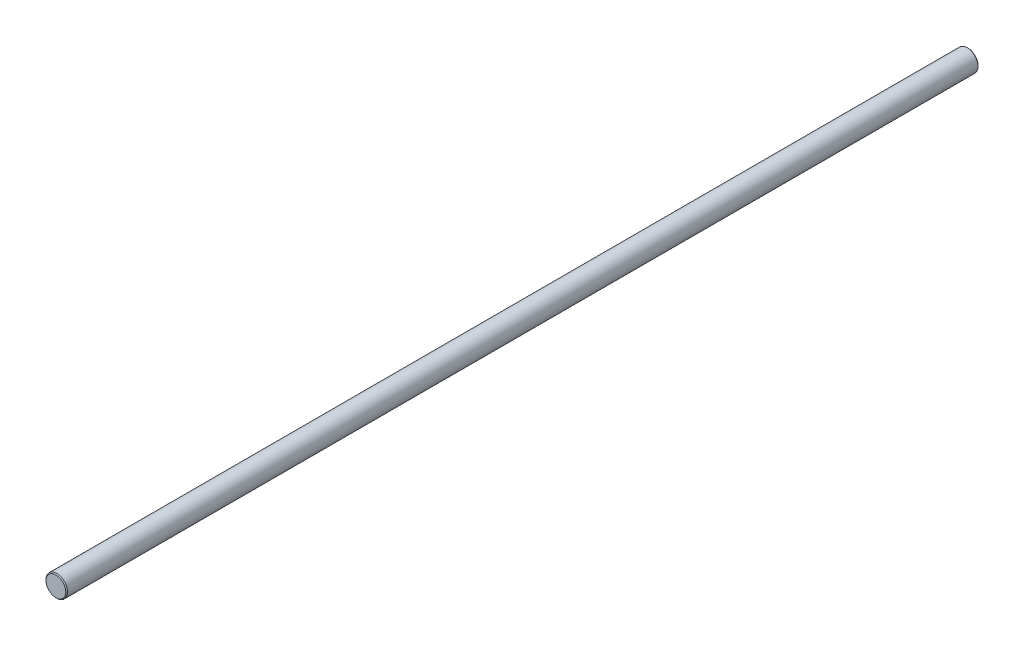
ISO-10303-21;
HEADER;
FILE_DESCRIPTION(('STEP AP214'),'2;1');
FILE_NAME('part.step','',(''),(''),'','','');
FILE_SCHEMA(('AUTOMOTIVE_DESIGN { 1 0 10303 214 1 1 1 1 }'));
ENDSEC;
DATA;
#1=APPLICATION_CONTEXT('core data for automotive mechanical design processes');
#2=APPLICATION_PROTOCOL_DEFINITION('international standard','automotive_design',2000,#1);
#3=PRODUCT_CONTEXT('',#1,'mechanical');
#4=PRODUCT('Part','Part','',(#3));
#5=PRODUCT_RELATED_PRODUCT_CATEGORY('part','',(#4));
#6=PRODUCT_DEFINITION_FORMATION('','',#4);
#7=PRODUCT_DEFINITION_CONTEXT('part definition',#1,'design');
#8=PRODUCT_DEFINITION('design','',#6,#7);
#9=PRODUCT_DEFINITION_SHAPE('','',#8);
#10=(LENGTH_UNIT() NAMED_UNIT(*) SI_UNIT(.MILLI.,.METRE.));
#11=(NAMED_UNIT(*) PLANE_ANGLE_UNIT() SI_UNIT($,.RADIAN.));
#12=(NAMED_UNIT(*) SI_UNIT($,.STERADIAN.) SOLID_ANGLE_UNIT());
#13=UNCERTAINTY_MEASURE_WITH_UNIT(LENGTH_MEASURE(1.E-05),#10,'distance_accuracy_value','');
#14=(GEOMETRIC_REPRESENTATION_CONTEXT(3) GLOBAL_UNCERTAINTY_ASSIGNED_CONTEXT((#13)) GLOBAL_UNIT_ASSIGNED_CONTEXT((#10,
#11,#12)) REPRESENTATION_CONTEXT('',''));
#15=CARTESIAN_POINT('',(0.,0.,0.));
#16=DIRECTION('',(0.,0.,1.));
#17=DIRECTION('',(1.,0.,0.));
#18=AXIS2_PLACEMENT_3D('',#15,#16,#17);
#19=CARTESIAN_POINT('',(0.,0.,530.));
#20=DIRECTION('',(0.,0.,-1.));
#21=DIRECTION('',(-1.,0.,0.));
#22=AXIS2_PLACEMENT_3D('',#19,#20,#21);
#23=CYLINDRICAL_SURFACE('',#22,12.5);
#24=CARTESIAN_POINT('',(-1.11022302462516E-13,-1.11022302462516E-13,-529.));
#25=DIRECTION('',(0.,0.,1.));
#26=DIRECTION('',(1.,0.,0.));
#27=AXIS2_PLACEMENT_3D('',#24,#25,#26);
#28=CIRCLE('',#27,12.5);
#29=CARTESIAN_POINT('',(12.4999999999999,-1.10328413072125E-13,-529.));
#30=VERTEX_POINT('',#29);
#31=EDGE_CURVE('E56',#30,#30,#28,.T.);
#32=ORIENTED_EDGE('',*,*,#31,.T.);
#33=EDGE_LOOP('',(#32));
#34=FACE_BOUND('',#33,.T.);
#35=CARTESIAN_POINT('',(0.,0.,529.));
#36=DIRECTION('',(0.,0.,1.));
#37=DIRECTION('',(1.,0.,0.));
#38=AXIS2_PLACEMENT_3D('',#35,#36,#37);
#39=CIRCLE('',#38,12.5);
#40=CARTESIAN_POINT('',(12.5,0.,529.));
#41=VERTEX_POINT('',#40);
#42=EDGE_CURVE('E60',#41,#41,#39,.F.);
#43=ORIENTED_EDGE('',*,*,#42,.T.);
#44=EDGE_LOOP('',(#43));
#45=FACE_BOUND('',#44,.T.);
#46=ADVANCED_FACE('F45',(#34,#45),#23,.T.);
#47=CARTESIAN_POINT('',(0.,0.,530.));
#48=DIRECTION('',(0.,0.,1.));
#49=DIRECTION('',(1.,0.,0.));
#50=AXIS2_PLACEMENT_3D('',#47,#48,#49);
#51=PLANE('',#50);
#52=CARTESIAN_POINT('',(0.,0.,530.));
#53=DIRECTION('',(0.,0.,1.));
#54=DIRECTION('',(1.,0.,0.));
#55=AXIS2_PLACEMENT_3D('',#52,#53,#54);
#56=CIRCLE('',#55,11.5000000000003);
#57=CARTESIAN_POINT('',(11.5000000000003,0.,530.));
#58=VERTEX_POINT('',#57);
#59=EDGE_CURVE('E12',#58,#58,#56,.T.);
#60=ORIENTED_EDGE('',*,*,#59,.T.);
#61=EDGE_LOOP('',(#60));
#62=FACE_BOUND('',#61,.T.);
#63=ADVANCED_FACE('F76',(#62),#51,.T.);
#64=CARTESIAN_POINT('',(-1.11022302462516E-13,-1.11022302462516E-13,-530.));
#65=DIRECTION('',(0.,0.,1.));
#66=DIRECTION('',(1.,0.,0.));
#67=AXIS2_PLACEMENT_3D('',#64,#65,#66);
#68=PLANE('',#67);
#69=CARTESIAN_POINT('',(-1.11022302462516E-13,-1.11022302462516E-13,-530.));
#70=DIRECTION('',(0.,0.,1.));
#71=DIRECTION('',(1.,0.,0.));
#72=AXIS2_PLACEMENT_3D('',#69,#70,#71);
#73=CIRCLE('',#72,11.5);
#74=CARTESIAN_POINT('',(11.4999999999999,-1.10383924223356E-13,-530.));
#75=VERTEX_POINT('',#74);
#76=EDGE_CURVE('E52',#75,#75,#73,.F.);
#77=ORIENTED_EDGE('',*,*,#76,.T.);
#78=EDGE_LOOP('',(#77));
#79=FACE_BOUND('',#78,.T.);
#80=ADVANCED_FACE('F73',(#79),#68,.F.);
#81=CARTESIAN_POINT('',(-1.11022302462516E-13,-1.11022302462516E-13,-529.));
#82=DIRECTION('',(0.,0.,1.));
#83=DIRECTION('',(1.,0.,0.));
#84=AXIS2_PLACEMENT_3D('',#81,#82,#83);
#85=CONICAL_SURFACE('',#84,12.5,0.785398163397415);
#86=ORIENTED_EDGE('',*,*,#76,.F.);
#87=EDGE_LOOP('',(#86));
#88=FACE_BOUND('',#87,.T.);
#89=ORIENTED_EDGE('',*,*,#31,.F.);
#90=EDGE_LOOP('',(#89));
#91=FACE_BOUND('',#90,.T.);
#92=ADVANCED_FACE('F69',(#88,#91),#85,.T.);
#93=CARTESIAN_POINT('',(0.,0.,530.));
#94=DIRECTION('',(0.,0.,-1.));
#95=DIRECTION('',(-1.,0.,0.));
#96=AXIS2_PLACEMENT_3D('',#93,#94,#95);
#97=CONICAL_SURFACE('',#96,11.5000000000003,0.785398163397415);
#98=ORIENTED_EDGE('',*,*,#42,.F.);
#99=EDGE_LOOP('',(#98));
#100=FACE_BOUND('',#99,.T.);
#101=ORIENTED_EDGE('',*,*,#59,.F.);
#102=EDGE_LOOP('',(#101));
#103=FACE_BOUND('',#102,.T.);
#104=ADVANCED_FACE('F47',(#100,#103),#97,.T.);
#105=CLOSED_SHELL('',(#46,#63,#80,#92,#104));
#106=MANIFOLD_SOLID_BREP('B2',#105);
#107=ADVANCED_BREP_SHAPE_REPRESENTATION('',(#18,#106),#14);
#108=SHAPE_DEFINITION_REPRESENTATION(#9,#107);
ENDSEC;
END-ISO-10303-21;
